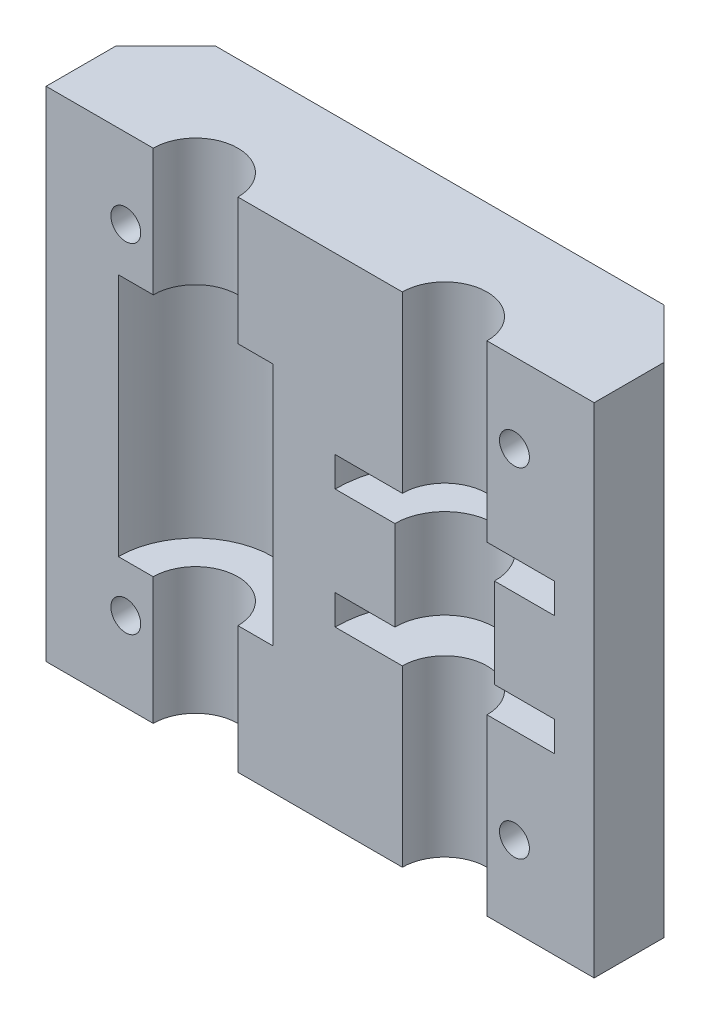
ISO-10303-21;
HEADER;
FILE_DESCRIPTION(('STEP AP214'),'2;1');
FILE_NAME('part.step','',(''),(''),'','','');
FILE_SCHEMA(('AUTOMOTIVE_DESIGN { 1 0 10303 214 1 1 1 1 }'));
ENDSEC;
DATA;
#1=APPLICATION_CONTEXT('core data for automotive mechanical design processes');
#2=APPLICATION_PROTOCOL_DEFINITION('international standard','automotive_design',2000,#1);
#3=PRODUCT_CONTEXT('',#1,'mechanical');
#4=PRODUCT('Part','Part','',(#3));
#5=PRODUCT_RELATED_PRODUCT_CATEGORY('part','',(#4));
#6=PRODUCT_DEFINITION_FORMATION('','',#4);
#7=PRODUCT_DEFINITION_CONTEXT('part definition',#1,'design');
#8=PRODUCT_DEFINITION('design','',#6,#7);
#9=PRODUCT_DEFINITION_SHAPE('','',#8);
#10=(LENGTH_UNIT() NAMED_UNIT(*) SI_UNIT(.MILLI.,.METRE.));
#11=(NAMED_UNIT(*) PLANE_ANGLE_UNIT() SI_UNIT($,.RADIAN.));
#12=(NAMED_UNIT(*) SI_UNIT($,.STERADIAN.) SOLID_ANGLE_UNIT());
#13=UNCERTAINTY_MEASURE_WITH_UNIT(LENGTH_MEASURE(1.E-05),#10,'distance_accuracy_value','');
#14=(GEOMETRIC_REPRESENTATION_CONTEXT(3) GLOBAL_UNCERTAINTY_ASSIGNED_CONTEXT((#13)) GLOBAL_UNIT_ASSIGNED_CONTEXT((#10,
#11,#12)) REPRESENTATION_CONTEXT('',''));
#15=CARTESIAN_POINT('',(0.,0.,0.));
#16=DIRECTION('',(0.,0.,1.));
#17=DIRECTION('',(1.,0.,0.));
#18=AXIS2_PLACEMENT_3D('',#15,#16,#17);
#19=CARTESIAN_POINT('',(0.,0.,12.));
#20=DIRECTION('',(0.,0.,-1.));
#21=DIRECTION('',(-1.,0.,0.));
#22=AXIS2_PLACEMENT_3D('',#19,#20,#21);
#23=PLANE('',#22);
#24=DIRECTION('',(-1.,0.,0.));
#25=VECTOR('',#24,1.);
#26=CARTESIAN_POINT('',(0.,-4.5,12.));
#27=LINE('',#26,#25);
#28=CARTESIAN_POINT('',(7.50000000000001,-4.5,12.));
#29=VERTEX_POINT('',#28);
#30=CARTESIAN_POINT('',(1.50000000000001,-4.5,12.));
#31=VERTEX_POINT('',#30);
#32=EDGE_CURVE('E214',#29,#31,#27,.T.);
#33=ORIENTED_EDGE('',*,*,#32,.F.);
#34=DIRECTION('',(0.,1.,0.));
#35=VECTOR('',#34,1.);
#36=CARTESIAN_POINT('',(7.50000000000001,-7.5,12.));
#37=LINE('',#36,#35);
#38=CARTESIAN_POINT('',(7.50000000000001,4.5,12.));
#39=VERTEX_POINT('',#38);
#40=EDGE_CURVE('E195',#29,#39,#37,.T.);
#41=ORIENTED_EDGE('',*,*,#40,.T.);
#42=DIRECTION('',(1.,0.,0.));
#43=VECTOR('',#42,1.);
#44=CARTESIAN_POINT('',(0.,4.5,12.));
#45=LINE('',#44,#43);
#46=CARTESIAN_POINT('',(1.50000000000001,4.5,12.));
#47=VERTEX_POINT('',#46);
#48=EDGE_CURVE('E276',#47,#39,#45,.T.);
#49=ORIENTED_EDGE('',*,*,#48,.F.);
#50=DIRECTION('',(0.,1.,0.));
#51=VECTOR('',#50,1.);
#52=CARTESIAN_POINT('',(1.50000000000001,4.5,12.));
#53=LINE('',#52,#51);
#54=CARTESIAN_POINT('',(1.50000000000001,7.5,12.));
#55=VERTEX_POINT('',#54);
#56=EDGE_CURVE('E279',#47,#55,#53,.T.);
#57=ORIENTED_EDGE('',*,*,#56,.T.);
#58=DIRECTION('',(1.,0.,0.));
#59=VECTOR('',#58,1.);
#60=CARTESIAN_POINT('',(0.,7.5,12.));
#61=LINE('',#60,#59);
#62=CARTESIAN_POINT('',(8.25000000000001,7.5,12.));
#63=VERTEX_POINT('',#62);
#64=EDGE_CURVE('E272',#55,#63,#61,.T.);
#65=ORIENTED_EDGE('',*,*,#64,.T.);
#66=DIRECTION('',(0.,1.,0.));
#67=VECTOR('',#66,1.);
#68=CARTESIAN_POINT('',(8.25000000000001,-25.,12.));
#69=LINE('',#68,#67);
#70=CARTESIAN_POINT('',(8.25000000000001,25.,12.));
#71=VERTEX_POINT('',#70);
#72=EDGE_CURVE('E348',#63,#71,#69,.T.);
#73=ORIENTED_EDGE('',*,*,#72,.T.);
#74=DIRECTION('',(-1.,0.,0.));
#75=VECTOR('',#74,1.);
#76=CARTESIAN_POINT('',(-27.5,25.,12.));
#77=LINE('',#76,#75);
#78=CARTESIAN_POINT('',(-8.24999999999999,25.,12.));
#79=VERTEX_POINT('',#78);
#80=EDGE_CURVE('E322',#71,#79,#77,.T.);
#81=ORIENTED_EDGE('',*,*,#80,.T.);
#82=DIRECTION('',(0.,1.,0.));
#83=VECTOR('',#82,1.);
#84=CARTESIAN_POINT('',(-8.24999999999999,-25.,12.));
#85=LINE('',#84,#83);
#86=CARTESIAN_POINT('',(-8.24999999999999,12.25,12.));
#87=VERTEX_POINT('',#86);
#88=EDGE_CURVE('E353',#79,#87,#85,.F.);
#89=ORIENTED_EDGE('',*,*,#88,.T.);
#90=DIRECTION('',(1.,0.,0.));
#91=VECTOR('',#90,1.);
#92=CARTESIAN_POINT('',(0.,12.25,12.));
#93=LINE('',#92,#91);
#94=CARTESIAN_POINT('',(-4.74999999999999,12.25,12.));
#95=VERTEX_POINT('',#94);
#96=EDGE_CURVE('E292',#87,#95,#93,.T.);
#97=ORIENTED_EDGE('',*,*,#96,.T.);
#98=DIRECTION('',(0.,-1.,0.));
#99=VECTOR('',#98,1.);
#100=CARTESIAN_POINT('',(-4.74999999999999,12.25,12.));
#101=LINE('',#100,#99);
#102=CARTESIAN_POINT('',(-4.74999999999999,-12.25,12.));
#103=VERTEX_POINT('',#102);
#104=EDGE_CURVE('E365',#103,#95,#101,.F.);
#105=ORIENTED_EDGE('',*,*,#104,.F.);
#106=DIRECTION('',(1.,0.,0.));
#107=VECTOR('',#106,1.);
#108=CARTESIAN_POINT('',(0.,-12.25,12.));
#109=LINE('',#108,#107);
#110=CARTESIAN_POINT('',(-8.24999999999999,-12.25,12.));
#111=VERTEX_POINT('',#110);
#112=EDGE_CURVE('E288',#111,#103,#109,.T.);
#113=ORIENTED_EDGE('',*,*,#112,.F.);
#114=CARTESIAN_POINT('',(-8.24999999999999,-25.,12.));
#115=VERTEX_POINT('',#114);
#116=EDGE_CURVE('E352',#111,#115,#85,.F.);
#117=ORIENTED_EDGE('',*,*,#116,.T.);
#118=DIRECTION('',(1.,0.,0.));
#119=VECTOR('',#118,1.);
#120=CARTESIAN_POINT('',(-27.5,-25.,12.));
#121=LINE('',#120,#119);
#122=CARTESIAN_POINT('',(8.25000000000001,-25.,12.));
#123=VERTEX_POINT('',#122);
#124=EDGE_CURVE('E329',#115,#123,#121,.T.);
#125=ORIENTED_EDGE('',*,*,#124,.T.);
#126=CARTESIAN_POINT('',(8.25000000000001,-7.5,12.));
#127=VERTEX_POINT('',#126);
#128=EDGE_CURVE('E349',#123,#127,#69,.T.);
#129=ORIENTED_EDGE('',*,*,#128,.T.);
#130=DIRECTION('',(1.,0.,0.));
#131=VECTOR('',#130,1.);
#132=CARTESIAN_POINT('',(0.,-7.5,12.));
#133=LINE('',#132,#131);
#134=CARTESIAN_POINT('',(1.50000000000001,-7.5,12.));
#135=VERTEX_POINT('',#134);
#136=EDGE_CURVE('E194',#135,#127,#133,.T.);
#137=ORIENTED_EDGE('',*,*,#136,.F.);
#138=DIRECTION('',(0.,-1.,0.));
#139=VECTOR('',#138,1.);
#140=CARTESIAN_POINT('',(1.50000000000001,-4.5,12.));
#141=LINE('',#140,#139);
#142=EDGE_CURVE('E203',#31,#135,#141,.T.);
#143=ORIENTED_EDGE('',*,*,#142,.F.);
#144=EDGE_LOOP('',(#33,#41,#49,#57,#65,#73,#81,#89,#97,#105,#113,#117,#125,#129,#137,#143));
#145=FACE_BOUND('',#144,.T.);
#146=ADVANCED_FACE('F34',(#145),#23,.F.);
#147=CARTESIAN_POINT('',(19.5,-17.,12.));
#148=DIRECTION('',(0.,0.,-1.));
#149=DIRECTION('',(1.,0.,0.));
#150=AXIS2_PLACEMENT_3D('',#147,#148,#149);
#151=CIRCLE('',#150,1.5);
#152=CARTESIAN_POINT('',(21.,-17.,12.));
#153=VERTEX_POINT('',#152);
#154=EDGE_CURVE('E245',#153,#153,#151,.T.);
#155=ORIENTED_EDGE('',*,*,#154,.T.);
#156=EDGE_LOOP('',(#155));
#157=FACE_BOUND('',#156,.T.);
#158=CARTESIAN_POINT('',(19.5,17.,12.));
#159=DIRECTION('',(0.,0.,-1.));
#160=DIRECTION('',(-1.,0.,0.));
#161=AXIS2_PLACEMENT_3D('',#158,#159,#160);
#162=CIRCLE('',#161,1.5);
#163=CARTESIAN_POINT('',(18.,17.,12.));
#164=VERTEX_POINT('',#163);
#165=EDGE_CURVE('E249',#164,#164,#162,.T.);
#166=ORIENTED_EDGE('',*,*,#165,.T.);
#167=EDGE_LOOP('',(#166));
#168=FACE_BOUND('',#167,.T.);
#169=DIRECTION('',(-1.,0.,0.));
#170=VECTOR('',#169,1.);
#171=CARTESIAN_POINT('',(0.,-4.5,12.));
#172=LINE('',#171,#170);
#173=CARTESIAN_POINT('',(23.5,-4.5,12.));
#174=VERTEX_POINT('',#173);
#175=CARTESIAN_POINT('',(17.5,-4.5,12.));
#176=VERTEX_POINT('',#175);
#177=EDGE_CURVE('E209',#174,#176,#172,.T.);
#178=ORIENTED_EDGE('',*,*,#177,.F.);
#179=DIRECTION('',(0.,-1.,0.));
#180=VECTOR('',#179,1.);
#181=CARTESIAN_POINT('',(23.5,-4.5,12.));
#182=LINE('',#181,#180);
#183=CARTESIAN_POINT('',(23.5,-7.5,12.));
#184=VERTEX_POINT('',#183);
#185=EDGE_CURVE('E11',#184,#174,#182,.F.);
#186=ORIENTED_EDGE('',*,*,#185,.F.);
#187=DIRECTION('',(1.,0.,0.));
#188=VECTOR('',#187,1.);
#189=CARTESIAN_POINT('',(0.,-7.5,12.));
#190=LINE('',#189,#188);
#191=CARTESIAN_POINT('',(16.75,-7.5,12.));
#192=VERTEX_POINT('',#191);
#193=EDGE_CURVE('E185',#192,#184,#190,.T.);
#194=ORIENTED_EDGE('',*,*,#193,.F.);
#195=DIRECTION('',(0.,1.,0.));
#196=VECTOR('',#195,1.);
#197=CARTESIAN_POINT('',(16.75,-25.,12.));
#198=LINE('',#197,#196);
#199=CARTESIAN_POINT('',(16.75,-25.,12.));
#200=VERTEX_POINT('',#199);
#201=EDGE_CURVE('E344',#192,#200,#198,.F.);
#202=ORIENTED_EDGE('',*,*,#201,.T.);
#203=CARTESIAN_POINT('',(27.5,-25.,12.));
#204=VERTEX_POINT('',#203);
#205=EDGE_CURVE('E324',#200,#204,#121,.T.);
#206=ORIENTED_EDGE('',*,*,#205,.T.);
#207=DIRECTION('',(0.,1.,0.));
#208=VECTOR('',#207,1.);
#209=CARTESIAN_POINT('',(27.5,-25.,12.));
#210=LINE('',#209,#208);
#211=CARTESIAN_POINT('',(27.5,25.,12.));
#212=VERTEX_POINT('',#211);
#213=EDGE_CURVE('E313',#204,#212,#210,.T.);
#214=ORIENTED_EDGE('',*,*,#213,.T.);
#215=CARTESIAN_POINT('',(16.75,25.,12.));
#216=VERTEX_POINT('',#215);
#217=EDGE_CURVE('E318',#212,#216,#77,.T.);
#218=ORIENTED_EDGE('',*,*,#217,.T.);
#219=CARTESIAN_POINT('',(16.75,7.5,12.));
#220=VERTEX_POINT('',#219);
#221=EDGE_CURVE('E345',#216,#220,#198,.F.);
#222=ORIENTED_EDGE('',*,*,#221,.T.);
#223=DIRECTION('',(1.,0.,0.));
#224=VECTOR('',#223,1.);
#225=CARTESIAN_POINT('',(0.,7.5,12.));
#226=LINE('',#225,#224);
#227=CARTESIAN_POINT('',(23.5,7.5,12.));
#228=VERTEX_POINT('',#227);
#229=EDGE_CURVE('E268',#220,#228,#226,.T.);
#230=ORIENTED_EDGE('',*,*,#229,.T.);
#231=DIRECTION('',(0.,1.,0.));
#232=VECTOR('',#231,1.);
#233=CARTESIAN_POINT('',(23.5,4.5,12.));
#234=LINE('',#233,#232);
#235=CARTESIAN_POINT('',(23.5,4.5,12.));
#236=VERTEX_POINT('',#235);
#237=EDGE_CURVE('E370',#228,#236,#234,.F.);
#238=ORIENTED_EDGE('',*,*,#237,.T.);
#239=DIRECTION('',(1.,0.,0.));
#240=VECTOR('',#239,1.);
#241=CARTESIAN_POINT('',(0.,4.5,12.));
#242=LINE('',#241,#240);
#243=CARTESIAN_POINT('',(17.5,4.5,12.));
#244=VERTEX_POINT('',#243);
#245=EDGE_CURVE('E274',#244,#236,#242,.T.);
#246=ORIENTED_EDGE('',*,*,#245,.F.);
#247=DIRECTION('',(0.,1.,0.));
#248=VECTOR('',#247,1.);
#249=CARTESIAN_POINT('',(17.5,-7.5,12.));
#250=LINE('',#249,#248);
#251=EDGE_CURVE('E211',#244,#176,#250,.F.);
#252=ORIENTED_EDGE('',*,*,#251,.T.);
#253=EDGE_LOOP('',(#178,#186,#194,#202,#206,#214,#218,#222,#230,#238,#246,#252));
#254=FACE_BOUND('',#253,.T.);
#255=ADVANCED_FACE('F207',(#157,#168,#254),#23,.F.);
#256=CARTESIAN_POINT('',(12.5,-7.5,12.));
#257=DIRECTION('',(0.,1.,0.));
#258=DIRECTION('',(0.,0.,1.));
#259=AXIS2_PLACEMENT_3D('',#256,#257,#258);
#260=CYLINDRICAL_SURFACE('',#259,5.);
#261=CARTESIAN_POINT('',(12.5,-4.5,12.));
#262=DIRECTION('',(0.,-1.,0.));
#263=DIRECTION('',(0.,0.,-1.));
#264=AXIS2_PLACEMENT_3D('',#261,#262,#263);
#265=CIRCLE('',#264,5.);
#266=EDGE_CURVE('E42',#176,#29,#265,.F.);
#267=ORIENTED_EDGE('',*,*,#266,.F.);
#268=ORIENTED_EDGE('',*,*,#251,.F.);
#269=CARTESIAN_POINT('',(12.5,4.5,12.));
#270=DIRECTION('',(0.,1.,0.));
#271=DIRECTION('',(0.,0.,1.));
#272=AXIS2_PLACEMENT_3D('',#269,#270,#271);
#273=CIRCLE('',#272,5.);
#274=EDGE_CURVE('E258',#244,#39,#273,.T.);
#275=ORIENTED_EDGE('',*,*,#274,.T.);
#276=ORIENTED_EDGE('',*,*,#40,.F.);
#277=EDGE_LOOP('',(#267,#268,#275,#276));
#278=FACE_BOUND('',#277,.T.);
#279=ADVANCED_FACE('F404',(#278),#260,.F.);
#280=CARTESIAN_POINT('',(-19.5,-17.,12.));
#281=DIRECTION('',(0.,0.,-1.));
#282=DIRECTION('',(-1.,0.,0.));
#283=AXIS2_PLACEMENT_3D('',#280,#281,#282);
#284=CYLINDRICAL_SURFACE('',#283,1.5);
#285=CARTESIAN_POINT('',(-19.5,-17.,12.));
#286=DIRECTION('',(0.,0.,-1.));
#287=DIRECTION('',(-1.,0.,0.));
#288=AXIS2_PLACEMENT_3D('',#285,#286,#287);
#289=CIRCLE('',#288,1.5);
#290=CARTESIAN_POINT('',(-21.,-17.,12.));
#291=VERTEX_POINT('',#290);
#292=EDGE_CURVE('E248',#291,#291,#289,.T.);
#293=ORIENTED_EDGE('',*,*,#292,.F.);
#294=EDGE_LOOP('',(#293));
#295=FACE_BOUND('',#294,.T.);
#296=CARTESIAN_POINT('',(-19.5,-17.,4.));
#297=DIRECTION('',(0.,0.,-1.));
#298=DIRECTION('',(-1.,0.,0.));
#299=AXIS2_PLACEMENT_3D('',#296,#297,#298);
#300=CIRCLE('',#299,1.5);
#301=CARTESIAN_POINT('',(-21.,-17.,4.));
#302=VERTEX_POINT('',#301);
#303=EDGE_CURVE('E255',#302,#302,#300,.F.);
#304=ORIENTED_EDGE('',*,*,#303,.F.);
#305=EDGE_LOOP('',(#304));
#306=FACE_BOUND('',#305,.T.);
#307=ADVANCED_FACE('F489',(#295,#306),#284,.F.);
#308=CARTESIAN_POINT('',(19.5,17.,12.));
#309=DIRECTION('',(0.,0.,-1.));
#310=DIRECTION('',(-1.,0.,0.));
#311=AXIS2_PLACEMENT_3D('',#308,#309,#310);
#312=CYLINDRICAL_SURFACE('',#311,1.5);
#313=ORIENTED_EDGE('',*,*,#165,.F.);
#314=EDGE_LOOP('',(#313));
#315=FACE_BOUND('',#314,.T.);
#316=CARTESIAN_POINT('',(19.5,17.,4.));
#317=DIRECTION('',(0.,0.,-1.));
#318=DIRECTION('',(-1.,0.,0.));
#319=AXIS2_PLACEMENT_3D('',#316,#317,#318);
#320=CIRCLE('',#319,1.5);
#321=CARTESIAN_POINT('',(18.,17.,4.));
#322=VERTEX_POINT('',#321);
#323=EDGE_CURVE('E377',#322,#322,#320,.F.);
#324=ORIENTED_EDGE('',*,*,#323,.F.);
#325=EDGE_LOOP('',(#324));
#326=FACE_BOUND('',#325,.T.);
#327=ADVANCED_FACE('F492',(#315,#326),#312,.F.);
#328=CARTESIAN_POINT('',(12.5,-25.,12.));
#329=DIRECTION('',(0.,1.,0.));
#330=DIRECTION('',(0.,0.,1.));
#331=AXIS2_PLACEMENT_3D('',#328,#329,#330);
#332=CYLINDRICAL_SURFACE('',#331,4.25000000000001);
#333=CARTESIAN_POINT('',(12.5,-7.5,12.));
#334=DIRECTION('',(0.,1.,0.));
#335=DIRECTION('',(0.,0.,1.));
#336=AXIS2_PLACEMENT_3D('',#333,#334,#335);
#337=CIRCLE('',#336,4.25000000000001);
#338=EDGE_CURVE('E190',#127,#192,#337,.F.);
#339=ORIENTED_EDGE('',*,*,#338,.F.);
#340=ORIENTED_EDGE('',*,*,#128,.F.);
#341=CARTESIAN_POINT('',(12.5,-25.,12.));
#342=DIRECTION('',(0.,1.,0.));
#343=DIRECTION('',(0.,0.,1.));
#344=AXIS2_PLACEMENT_3D('',#341,#342,#343);
#345=CIRCLE('',#344,4.25000000000001);
#346=EDGE_CURVE('E308',#200,#123,#345,.T.);
#347=ORIENTED_EDGE('',*,*,#346,.F.);
#348=ORIENTED_EDGE('',*,*,#201,.F.);
#349=EDGE_LOOP('',(#339,#340,#347,#348));
#350=FACE_BOUND('',#349,.T.);
#351=ADVANCED_FACE('F468',(#350),#332,.F.);
#352=CARTESIAN_POINT('',(-12.5,-25.,12.));
#353=DIRECTION('',(0.,1.,0.));
#354=DIRECTION('',(0.,0.,1.));
#355=AXIS2_PLACEMENT_3D('',#352,#353,#354);
#356=CYLINDRICAL_SURFACE('',#355,4.25);
#357=CARTESIAN_POINT('',(-12.5,-12.25,12.));
#358=DIRECTION('',(0.,1.,0.));
#359=DIRECTION('',(0.,0.,1.));
#360=AXIS2_PLACEMENT_3D('',#357,#358,#359);
#361=CIRCLE('',#360,4.25);
#362=CARTESIAN_POINT('',(-16.75,-12.25,12.));
#363=VERTEX_POINT('',#362);
#364=EDGE_CURVE('E360',#363,#111,#361,.F.);
#365=ORIENTED_EDGE('',*,*,#364,.F.);
#366=DIRECTION('',(0.,1.,0.));
#367=VECTOR('',#366,1.);
#368=CARTESIAN_POINT('',(-16.75,-25.,12.));
#369=LINE('',#368,#367);
#370=CARTESIAN_POINT('',(-16.75,-25.,12.));
#371=VERTEX_POINT('',#370);
#372=EDGE_CURVE('E357',#371,#363,#369,.T.);
#373=ORIENTED_EDGE('',*,*,#372,.F.);
#374=CARTESIAN_POINT('',(-12.5,-25.,12.));
#375=DIRECTION('',(0.,1.,0.));
#376=DIRECTION('',(0.,0.,1.));
#377=AXIS2_PLACEMENT_3D('',#374,#375,#376);
#378=CIRCLE('',#377,4.25);
#379=EDGE_CURVE('E301',#115,#371,#378,.T.);
#380=ORIENTED_EDGE('',*,*,#379,.F.);
#381=ORIENTED_EDGE('',*,*,#116,.F.);
#382=EDGE_LOOP('',(#365,#373,#380,#381));
#383=FACE_BOUND('',#382,.T.);
#384=ADVANCED_FACE('F444',(#383),#356,.F.);
#385=CARTESIAN_POINT('',(-19.5,17.,12.));
#386=DIRECTION('',(0.,0.,-1.));
#387=DIRECTION('',(1.,0.,0.));
#388=AXIS2_PLACEMENT_3D('',#385,#386,#387);
#389=CIRCLE('',#388,1.5);
#390=CARTESIAN_POINT('',(-18.,17.,12.));
#391=VERTEX_POINT('',#390);
#392=EDGE_CURVE('E252',#391,#391,#389,.T.);
#393=ORIENTED_EDGE('',*,*,#392,.T.);
#394=EDGE_LOOP('',(#393));
#395=FACE_BOUND('',#394,.T.);
#396=ORIENTED_EDGE('',*,*,#292,.T.);
#397=EDGE_LOOP('',(#396));
#398=FACE_BOUND('',#397,.T.);
#399=DIRECTION('',(0.,-1.,0.));
#400=VECTOR('',#399,1.);
#401=CARTESIAN_POINT('',(-20.25,12.25,12.));
#402=LINE('',#401,#400);
#403=CARTESIAN_POINT('',(-20.25,12.25,12.));
#404=VERTEX_POINT('',#403);
#405=CARTESIAN_POINT('',(-20.25,-12.25,12.));
#406=VERTEX_POINT('',#405);
#407=EDGE_CURVE('E298',#404,#406,#402,.T.);
#408=ORIENTED_EDGE('',*,*,#407,.F.);
#409=DIRECTION('',(1.,0.,0.));
#410=VECTOR('',#409,1.);
#411=CARTESIAN_POINT('',(0.,12.25,12.));
#412=LINE('',#411,#410);
#413=CARTESIAN_POINT('',(-16.75,12.25,12.));
#414=VERTEX_POINT('',#413);
#415=EDGE_CURVE('E295',#404,#414,#412,.T.);
#416=ORIENTED_EDGE('',*,*,#415,.T.);
#417=CARTESIAN_POINT('',(-16.75,25.,12.));
#418=VERTEX_POINT('',#417);
#419=EDGE_CURVE('E356',#414,#418,#369,.T.);
#420=ORIENTED_EDGE('',*,*,#419,.T.);
#421=CARTESIAN_POINT('',(-27.5,25.,12.));
#422=VERTEX_POINT('',#421);
#423=EDGE_CURVE('E316',#418,#422,#77,.T.);
#424=ORIENTED_EDGE('',*,*,#423,.T.);
#425=DIRECTION('',(0.,-1.,0.));
#426=VECTOR('',#425,1.);
#427=CARTESIAN_POINT('',(-27.5,-25.,12.));
#428=LINE('',#427,#426);
#429=CARTESIAN_POINT('',(-27.5,-25.,12.));
#430=VERTEX_POINT('',#429);
#431=EDGE_CURVE('E321',#422,#430,#428,.T.);
#432=ORIENTED_EDGE('',*,*,#431,.T.);
#433=EDGE_CURVE('E325',#430,#371,#121,.T.);
#434=ORIENTED_EDGE('',*,*,#433,.T.);
#435=ORIENTED_EDGE('',*,*,#372,.T.);
#436=DIRECTION('',(1.,0.,0.));
#437=VECTOR('',#436,1.);
#438=CARTESIAN_POINT('',(0.,-12.25,12.));
#439=LINE('',#438,#437);
#440=EDGE_CURVE('E290',#406,#363,#439,.T.);
#441=ORIENTED_EDGE('',*,*,#440,.F.);
#442=EDGE_LOOP('',(#408,#416,#420,#424,#432,#434,#435,#441));
#443=FACE_BOUND('',#442,.T.);
#444=ADVANCED_FACE('F428',(#395,#398,#443),#23,.F.);
#445=CARTESIAN_POINT('',(27.5,-25.,12.));
#446=DIRECTION('',(-1.,0.,0.));
#447=DIRECTION('',(0.,0.,1.));
#448=AXIS2_PLACEMENT_3D('',#445,#446,#447);
#449=PLANE('',#448);
#450=DIRECTION('',(0.,0.,-1.));
#451=VECTOR('',#450,1.);
#452=CARTESIAN_POINT('',(27.5,-25.,12.));
#453=LINE('',#452,#451);
#454=CARTESIAN_POINT('',(27.5,-25.,5.));
#455=VERTEX_POINT('',#454);
#456=EDGE_CURVE('E328',#204,#455,#453,.T.);
#457=ORIENTED_EDGE('',*,*,#456,.T.);
#458=DIRECTION('',(0.,1.,0.));
#459=VECTOR('',#458,1.);
#460=CARTESIAN_POINT('',(27.5,25.,5.));
#461=LINE('',#460,#459);
#462=CARTESIAN_POINT('',(27.5,25.,5.));
#463=VERTEX_POINT('',#462);
#464=EDGE_CURVE('E374',#455,#463,#461,.T.);
#465=ORIENTED_EDGE('',*,*,#464,.T.);
#466=DIRECTION('',(0.,0.,-1.));
#467=VECTOR('',#466,1.);
#468=CARTESIAN_POINT('',(27.5,25.,12.));
#469=LINE('',#468,#467);
#470=EDGE_CURVE('E341',#212,#463,#469,.T.);
#471=ORIENTED_EDGE('',*,*,#470,.F.);
#472=ORIENTED_EDGE('',*,*,#213,.F.);
#473=EDGE_LOOP('',(#457,#465,#471,#472));
#474=FACE_BOUND('',#473,.T.);
#475=ADVANCED_FACE('F478',(#474),#449,.F.);
#476=CARTESIAN_POINT('',(-27.5,25.,12.));
#477=DIRECTION('',(0.,-1.,0.));
#478=DIRECTION('',(0.,0.,-1.));
#479=AXIS2_PLACEMENT_3D('',#476,#477,#478);
#480=PLANE('',#479);
#481=ORIENTED_EDGE('',*,*,#470,.T.);
#482=DIRECTION('',(-0.707106781186549,0.,-0.707106781186546));
#483=VECTOR('',#482,1.);
#484=CARTESIAN_POINT('',(27.5,25.,5.));
#485=LINE('',#484,#483);
#486=CARTESIAN_POINT('',(22.5,25.,0.));
#487=VERTEX_POINT('',#486);
#488=EDGE_CURVE('E389',#463,#487,#485,.T.);
#489=ORIENTED_EDGE('',*,*,#488,.T.);
#490=DIRECTION('',(-1.,0.,0.));
#491=VECTOR('',#490,1.);
#492=CARTESIAN_POINT('',(-27.5,25.,0.));
#493=LINE('',#492,#491);
#494=CARTESIAN_POINT('',(-22.5,25.,0.));
#495=VERTEX_POINT('',#494);
#496=EDGE_CURVE('E304',#487,#495,#493,.T.);
#497=ORIENTED_EDGE('',*,*,#496,.T.);
#498=DIRECTION('',(-0.707106781186549,0.,0.707106781186546));
#499=VECTOR('',#498,1.);
#500=CARTESIAN_POINT('',(-27.5,25.,5.));
#501=LINE('',#500,#499);
#502=CARTESIAN_POINT('',(-27.5,25.,5.));
#503=VERTEX_POINT('',#502);
#504=EDGE_CURVE('E387',#495,#503,#501,.T.);
#505=ORIENTED_EDGE('',*,*,#504,.T.);
#506=DIRECTION('',(0.,0.,-1.));
#507=VECTOR('',#506,1.);
#508=CARTESIAN_POINT('',(-27.5,25.,12.));
#509=LINE('',#508,#507);
#510=EDGE_CURVE('E338',#422,#503,#509,.T.);
#511=ORIENTED_EDGE('',*,*,#510,.F.);
#512=ORIENTED_EDGE('',*,*,#423,.F.);
#513=CARTESIAN_POINT('',(-12.5,25.,12.));
#514=DIRECTION('',(0.,1.,0.));
#515=DIRECTION('',(0.,0.,1.));
#516=AXIS2_PLACEMENT_3D('',#513,#514,#515);
#517=CIRCLE('',#516,4.25);
#518=EDGE_CURVE('E305',#79,#418,#517,.T.);
#519=ORIENTED_EDGE('',*,*,#518,.F.);
#520=ORIENTED_EDGE('',*,*,#80,.F.);
#521=CARTESIAN_POINT('',(12.5,25.,12.));
#522=DIRECTION('',(0.,1.,0.));
#523=DIRECTION('',(0.,0.,1.));
#524=AXIS2_PLACEMENT_3D('',#521,#522,#523);
#525=CIRCLE('',#524,4.25000000000001);
#526=EDGE_CURVE('E300',#216,#71,#525,.T.);
#527=ORIENTED_EDGE('',*,*,#526,.F.);
#528=ORIENTED_EDGE('',*,*,#217,.F.);
#529=EDGE_LOOP('',(#481,#489,#497,#505,#511,#512,#519,#520,#527,#528));
#530=FACE_BOUND('',#529,.T.);
#531=ADVANCED_FACE('F432',(#530),#480,.F.);
#532=CARTESIAN_POINT('',(-27.5,-25.,12.));
#533=DIRECTION('',(1.,0.,0.));
#534=DIRECTION('',(0.,0.,-1.));
#535=AXIS2_PLACEMENT_3D('',#532,#533,#534);
#536=PLANE('',#535);
#537=ORIENTED_EDGE('',*,*,#510,.T.);
#538=DIRECTION('',(0.,-1.,0.));
#539=VECTOR('',#538,1.);
#540=CARTESIAN_POINT('',(-27.5,-25.,5.));
#541=LINE('',#540,#539);
#542=CARTESIAN_POINT('',(-27.5,-25.,5.));
#543=VERTEX_POINT('',#542);
#544=EDGE_CURVE('E397',#503,#543,#541,.T.);
#545=ORIENTED_EDGE('',*,*,#544,.T.);
#546=DIRECTION('',(0.,0.,-1.));
#547=VECTOR('',#546,1.);
#548=CARTESIAN_POINT('',(-27.5,-25.,12.));
#549=LINE('',#548,#547);
#550=EDGE_CURVE('E335',#430,#543,#549,.T.);
#551=ORIENTED_EDGE('',*,*,#550,.F.);
#552=ORIENTED_EDGE('',*,*,#431,.F.);
#553=EDGE_LOOP('',(#537,#545,#551,#552));
#554=FACE_BOUND('',#553,.T.);
#555=ADVANCED_FACE('F435',(#554),#536,.F.);
#556=CARTESIAN_POINT('',(-27.5,-25.,12.));
#557=DIRECTION('',(0.,1.,0.));
#558=DIRECTION('',(0.,0.,1.));
#559=AXIS2_PLACEMENT_3D('',#556,#557,#558);
#560=PLANE('',#559);
#561=DIRECTION('',(1.,0.,0.));
#562=VECTOR('',#561,1.);
#563=CARTESIAN_POINT('',(-27.5,-25.,0.));
#564=LINE('',#563,#562);
#565=CARTESIAN_POINT('',(-22.5,-25.,0.));
#566=VERTEX_POINT('',#565);
#567=CARTESIAN_POINT('',(22.5,-25.,0.));
#568=VERTEX_POINT('',#567);
#569=EDGE_CURVE('E317',#566,#568,#564,.T.);
#570=ORIENTED_EDGE('',*,*,#569,.T.);
#571=DIRECTION('',(0.707106781186549,0.,0.707106781186546));
#572=VECTOR('',#571,1.);
#573=CARTESIAN_POINT('',(27.5,-25.,5.));
#574=LINE('',#573,#572);
#575=EDGE_CURVE('E395',#568,#455,#574,.T.);
#576=ORIENTED_EDGE('',*,*,#575,.T.);
#577=ORIENTED_EDGE('',*,*,#456,.F.);
#578=ORIENTED_EDGE('',*,*,#205,.F.);
#579=ORIENTED_EDGE('',*,*,#346,.T.);
#580=ORIENTED_EDGE('',*,*,#124,.F.);
#581=ORIENTED_EDGE('',*,*,#379,.T.);
#582=ORIENTED_EDGE('',*,*,#433,.F.);
#583=ORIENTED_EDGE('',*,*,#550,.T.);
#584=DIRECTION('',(0.707106781186549,0.,-0.707106781186546));
#585=VECTOR('',#584,1.);
#586=CARTESIAN_POINT('',(-27.5,-25.,5.));
#587=LINE('',#586,#585);
#588=EDGE_CURVE('E49',#543,#566,#587,.T.);
#589=ORIENTED_EDGE('',*,*,#588,.T.);
#590=EDGE_LOOP('',(#570,#576,#577,#578,#579,#580,#581,#582,#583,#589));
#591=FACE_BOUND('',#590,.T.);
#592=ADVANCED_FACE('F438',(#591),#560,.F.);
#593=CARTESIAN_POINT('',(0.,0.,0.));
#594=DIRECTION('',(0.,0.,-1.));
#595=DIRECTION('',(-1.,0.,0.));
#596=AXIS2_PLACEMENT_3D('',#593,#594,#595);
#597=PLANE('',#596);
#598=CARTESIAN_POINT('',(19.5,-17.,0.));
#599=DIRECTION('',(0.,0.,-1.));
#600=DIRECTION('',(1.,0.,0.));
#601=AXIS2_PLACEMENT_3D('',#598,#599,#600);
#602=CIRCLE('',#601,2.5);
#603=CARTESIAN_POINT('',(22.,-17.,0.));
#604=VERTEX_POINT('',#603);
#605=EDGE_CURVE('E220',#604,#604,#602,.T.);
#606=ORIENTED_EDGE('',*,*,#605,.F.);
#607=EDGE_LOOP('',(#606));
#608=FACE_BOUND('',#607,.T.);
#609=CARTESIAN_POINT('',(19.5,17.,0.));
#610=DIRECTION('',(0.,0.,-1.));
#611=DIRECTION('',(-1.,0.,0.));
#612=AXIS2_PLACEMENT_3D('',#609,#610,#611);
#613=CIRCLE('',#612,2.5);
#614=CARTESIAN_POINT('',(17.,17.,0.));
#615=VERTEX_POINT('',#614);
#616=EDGE_CURVE('E231',#615,#615,#613,.T.);
#617=ORIENTED_EDGE('',*,*,#616,.F.);
#618=EDGE_LOOP('',(#617));
#619=FACE_BOUND('',#618,.T.);
#620=CARTESIAN_POINT('',(-19.5,17.,0.));
#621=DIRECTION('',(0.,0.,-1.));
#622=DIRECTION('',(1.,0.,0.));
#623=AXIS2_PLACEMENT_3D('',#620,#621,#622);
#624=CIRCLE('',#623,2.5);
#625=CARTESIAN_POINT('',(-17.,17.,0.));
#626=VERTEX_POINT('',#625);
#627=EDGE_CURVE('E225',#626,#626,#624,.T.);
#628=ORIENTED_EDGE('',*,*,#627,.F.);
#629=EDGE_LOOP('',(#628));
#630=FACE_BOUND('',#629,.T.);
#631=CARTESIAN_POINT('',(-19.5,-17.,0.));
#632=DIRECTION('',(0.,0.,-1.));
#633=DIRECTION('',(-1.,0.,0.));
#634=AXIS2_PLACEMENT_3D('',#631,#632,#633);
#635=CIRCLE('',#634,2.5);
#636=CARTESIAN_POINT('',(-22.,-17.,0.));
#637=VERTEX_POINT('',#636);
#638=EDGE_CURVE('E224',#637,#637,#635,.T.);
#639=ORIENTED_EDGE('',*,*,#638,.F.);
#640=EDGE_LOOP('',(#639));
#641=FACE_BOUND('',#640,.T.);
#642=ORIENTED_EDGE('',*,*,#496,.F.);
#643=DIRECTION('',(0.,-1.,0.));
#644=VECTOR('',#643,1.);
#645=CARTESIAN_POINT('',(22.5,-25.,0.));
#646=LINE('',#645,#644);
#647=EDGE_CURVE('E57',#487,#568,#646,.T.);
#648=ORIENTED_EDGE('',*,*,#647,.T.);
#649=ORIENTED_EDGE('',*,*,#569,.F.);
#650=DIRECTION('',(0.,1.,0.));
#651=VECTOR('',#650,1.);
#652=CARTESIAN_POINT('',(-22.5,25.,0.));
#653=LINE('',#652,#651);
#654=EDGE_CURVE('E391',#566,#495,#653,.T.);
#655=ORIENTED_EDGE('',*,*,#654,.T.);
#656=EDGE_LOOP('',(#642,#648,#649,#655));
#657=FACE_BOUND('',#656,.T.);
#658=ADVANCED_FACE('F466',(#608,#619,#630,#641,#657),#597,.T.);
#659=ORIENTED_EDGE('',*,*,#72,.F.);
#660=CARTESIAN_POINT('',(12.5,7.5,12.));
#661=DIRECTION('',(0.,1.,0.));
#662=DIRECTION('',(0.,0.,1.));
#663=AXIS2_PLACEMENT_3D('',#660,#661,#662);
#664=CIRCLE('',#663,4.25000000000001);
#665=EDGE_CURVE('E367',#63,#220,#664,.F.);
#666=ORIENTED_EDGE('',*,*,#665,.T.);
#667=ORIENTED_EDGE('',*,*,#221,.F.);
#668=ORIENTED_EDGE('',*,*,#526,.T.);
#669=EDGE_LOOP('',(#659,#666,#667,#668));
#670=FACE_BOUND('',#669,.T.);
#671=ADVANCED_FACE('F418',(#670),#332,.F.);
#672=ORIENTED_EDGE('',*,*,#419,.F.);
#673=CARTESIAN_POINT('',(-12.5,12.25,12.));
#674=DIRECTION('',(0.,1.,0.));
#675=DIRECTION('',(0.,0.,1.));
#676=AXIS2_PLACEMENT_3D('',#673,#674,#675);
#677=CIRCLE('',#676,4.25);
#678=EDGE_CURVE('E362',#414,#87,#677,.F.);
#679=ORIENTED_EDGE('',*,*,#678,.T.);
#680=ORIENTED_EDGE('',*,*,#88,.F.);
#681=ORIENTED_EDGE('',*,*,#518,.T.);
#682=EDGE_LOOP('',(#672,#679,#680,#681));
#683=FACE_BOUND('',#682,.T.);
#684=ADVANCED_FACE('F458',(#683),#356,.F.);
#685=CARTESIAN_POINT('',(-12.5,12.25,12.));
#686=DIRECTION('',(0.,-1.,0.));
#687=DIRECTION('',(0.,0.,-1.));
#688=AXIS2_PLACEMENT_3D('',#685,#686,#687);
#689=CYLINDRICAL_SURFACE('',#688,7.75);
#690=ORIENTED_EDGE('',*,*,#407,.T.);
#691=CARTESIAN_POINT('',(-12.5,-12.25,12.));
#692=DIRECTION('',(0.,1.,0.));
#693=DIRECTION('',(0.,0.,1.));
#694=AXIS2_PLACEMENT_3D('',#691,#692,#693);
#695=CIRCLE('',#694,7.75);
#696=EDGE_CURVE('E282',#103,#406,#695,.T.);
#697=ORIENTED_EDGE('',*,*,#696,.F.);
#698=ORIENTED_EDGE('',*,*,#104,.T.);
#699=CARTESIAN_POINT('',(-12.5,12.25,12.));
#700=DIRECTION('',(0.,1.,0.));
#701=DIRECTION('',(0.,0.,1.));
#702=AXIS2_PLACEMENT_3D('',#699,#700,#701);
#703=CIRCLE('',#702,7.75);
#704=EDGE_CURVE('E285',#95,#404,#703,.T.);
#705=ORIENTED_EDGE('',*,*,#704,.T.);
#706=EDGE_LOOP('',(#690,#697,#698,#705));
#707=FACE_BOUND('',#706,.T.);
#708=ADVANCED_FACE('F454',(#707),#689,.F.);
#709=CARTESIAN_POINT('',(-12.5,12.25,12.));
#710=DIRECTION('',(0.,1.,0.));
#711=DIRECTION('',(0.,0.,1.));
#712=AXIS2_PLACEMENT_3D('',#709,#710,#711);
#713=PLANE('',#712);
#714=ORIENTED_EDGE('',*,*,#704,.F.);
#715=ORIENTED_EDGE('',*,*,#96,.F.);
#716=ORIENTED_EDGE('',*,*,#678,.F.);
#717=ORIENTED_EDGE('',*,*,#415,.F.);
#718=EDGE_LOOP('',(#714,#715,#716,#717));
#719=FACE_BOUND('',#718,.T.);
#720=ADVANCED_FACE('F456',(#719),#713,.F.);
#721=CARTESIAN_POINT('',(-12.5,-12.25,12.));
#722=DIRECTION('',(0.,1.,0.));
#723=DIRECTION('',(0.,0.,1.));
#724=AXIS2_PLACEMENT_3D('',#721,#722,#723);
#725=PLANE('',#724);
#726=ORIENTED_EDGE('',*,*,#440,.T.);
#727=ORIENTED_EDGE('',*,*,#364,.T.);
#728=ORIENTED_EDGE('',*,*,#112,.T.);
#729=ORIENTED_EDGE('',*,*,#696,.T.);
#730=EDGE_LOOP('',(#726,#727,#728,#729));
#731=FACE_BOUND('',#730,.T.);
#732=ADVANCED_FACE('F448',(#731),#725,.T.);
#733=CARTESIAN_POINT('',(12.5,4.5,12.));
#734=DIRECTION('',(0.,1.,0.));
#735=DIRECTION('',(0.,0.,1.));
#736=AXIS2_PLACEMENT_3D('',#733,#734,#735);
#737=CYLINDRICAL_SURFACE('',#736,11.);
#738=CARTESIAN_POINT('',(12.5,4.5,12.));
#739=DIRECTION('',(0.,1.,0.));
#740=DIRECTION('',(0.,0.,1.));
#741=AXIS2_PLACEMENT_3D('',#738,#739,#740);
#742=CIRCLE('',#741,11.);
#743=EDGE_CURVE('E265',#236,#47,#742,.T.);
#744=ORIENTED_EDGE('',*,*,#743,.F.);
#745=ORIENTED_EDGE('',*,*,#237,.F.);
#746=CARTESIAN_POINT('',(12.5,7.5,12.));
#747=DIRECTION('',(0.,1.,0.));
#748=DIRECTION('',(0.,0.,1.));
#749=AXIS2_PLACEMENT_3D('',#746,#747,#748);
#750=CIRCLE('',#749,11.);
#751=EDGE_CURVE('E264',#228,#55,#750,.T.);
#752=ORIENTED_EDGE('',*,*,#751,.T.);
#753=ORIENTED_EDGE('',*,*,#56,.F.);
#754=EDGE_LOOP('',(#744,#745,#752,#753));
#755=FACE_BOUND('',#754,.T.);
#756=ADVANCED_FACE('F411',(#755),#737,.F.);
#757=CARTESIAN_POINT('',(12.5,4.5,12.));
#758=DIRECTION('',(0.,1.,0.));
#759=DIRECTION('',(0.,0.,1.));
#760=AXIS2_PLACEMENT_3D('',#757,#758,#759);
#761=PLANE('',#760);
#762=ORIENTED_EDGE('',*,*,#274,.F.);
#763=ORIENTED_EDGE('',*,*,#245,.T.);
#764=ORIENTED_EDGE('',*,*,#743,.T.);
#765=ORIENTED_EDGE('',*,*,#48,.T.);
#766=EDGE_LOOP('',(#762,#763,#764,#765));
#767=FACE_BOUND('',#766,.T.);
#768=ADVANCED_FACE('F407',(#767),#761,.T.);
#769=CARTESIAN_POINT('',(12.5,7.5,12.));
#770=DIRECTION('',(0.,1.,0.));
#771=DIRECTION('',(0.,0.,1.));
#772=AXIS2_PLACEMENT_3D('',#769,#770,#771);
#773=PLANE('',#772);
#774=ORIENTED_EDGE('',*,*,#751,.F.);
#775=ORIENTED_EDGE('',*,*,#229,.F.);
#776=ORIENTED_EDGE('',*,*,#665,.F.);
#777=ORIENTED_EDGE('',*,*,#64,.F.);
#778=EDGE_LOOP('',(#774,#775,#776,#777));
#779=FACE_BOUND('',#778,.T.);
#780=ADVANCED_FACE('F415',(#779),#773,.F.);
#781=CARTESIAN_POINT('',(12.5,-7.5,12.));
#782=DIRECTION('',(0.,1.,0.));
#783=DIRECTION('',(0.,0.,1.));
#784=AXIS2_PLACEMENT_3D('',#781,#782,#783);
#785=PLANE('',#784);
#786=ORIENTED_EDGE('',*,*,#136,.T.);
#787=ORIENTED_EDGE('',*,*,#338,.T.);
#788=ORIENTED_EDGE('',*,*,#193,.T.);
#789=CARTESIAN_POINT('',(12.5,-7.5,12.));
#790=DIRECTION('',(0.,1.,0.));
#791=DIRECTION('',(0.,0.,1.));
#792=AXIS2_PLACEMENT_3D('',#789,#790,#791);
#793=CIRCLE('',#792,11.);
#794=EDGE_CURVE('E188',#184,#135,#793,.T.);
#795=ORIENTED_EDGE('',*,*,#794,.T.);
#796=EDGE_LOOP('',(#786,#787,#788,#795));
#797=FACE_BOUND('',#796,.T.);
#798=ADVANCED_FACE('F187',(#797),#785,.T.);
#799=CARTESIAN_POINT('',(19.5,-17.,12.));
#800=DIRECTION('',(0.,0.,-1.));
#801=DIRECTION('',(-1.,0.,0.));
#802=AXIS2_PLACEMENT_3D('',#799,#800,#801);
#803=CYLINDRICAL_SURFACE('',#802,1.5);
#804=CARTESIAN_POINT('',(19.5,-17.,4.));
#805=DIRECTION('',(0.,0.,1.));
#806=DIRECTION('',(1.,0.,0.));
#807=AXIS2_PLACEMENT_3D('',#804,#805,#806);
#808=CIRCLE('',#807,1.5);
#809=CARTESIAN_POINT('',(21.,-17.,4.));
#810=VERTEX_POINT('',#809);
#811=EDGE_CURVE('E380',#810,#810,#808,.F.);
#812=ORIENTED_EDGE('',*,*,#811,.T.);
#813=EDGE_LOOP('',(#812));
#814=FACE_BOUND('',#813,.T.);
#815=ORIENTED_EDGE('',*,*,#154,.F.);
#816=EDGE_LOOP('',(#815));
#817=FACE_BOUND('',#816,.T.);
#818=ADVANCED_FACE('F514',(#814,#817),#803,.F.);
#819=CARTESIAN_POINT('',(-19.5,17.,12.));
#820=DIRECTION('',(0.,0.,-1.));
#821=DIRECTION('',(-1.,0.,0.));
#822=AXIS2_PLACEMENT_3D('',#819,#820,#821);
#823=CYLINDRICAL_SURFACE('',#822,1.5);
#824=CARTESIAN_POINT('',(-19.5,17.,4.));
#825=DIRECTION('',(0.,0.,1.));
#826=DIRECTION('',(1.,0.,0.));
#827=AXIS2_PLACEMENT_3D('',#824,#825,#826);
#828=CIRCLE('',#827,1.5);
#829=CARTESIAN_POINT('',(-18.,17.,4.));
#830=VERTEX_POINT('',#829);
#831=EDGE_CURVE('E242',#830,#830,#828,.F.);
#832=ORIENTED_EDGE('',*,*,#831,.T.);
#833=EDGE_LOOP('',(#832));
#834=FACE_BOUND('',#833,.T.);
#835=ORIENTED_EDGE('',*,*,#392,.F.);
#836=EDGE_LOOP('',(#835));
#837=FACE_BOUND('',#836,.T.);
#838=ADVANCED_FACE('F517',(#834,#837),#823,.F.);
#839=CARTESIAN_POINT('',(-19.5,17.,4.));
#840=DIRECTION('',(0.,0.,1.));
#841=DIRECTION('',(1.,0.,0.));
#842=AXIS2_PLACEMENT_3D('',#839,#840,#841);
#843=PLANE('',#842);
#844=CARTESIAN_POINT('',(-19.5,17.,4.));
#845=DIRECTION('',(0.,0.,-1.));
#846=DIRECTION('',(1.,0.,0.));
#847=AXIS2_PLACEMENT_3D('',#844,#845,#846);
#848=CIRCLE('',#847,2.5);
#849=CARTESIAN_POINT('',(-17.,17.,4.));
#850=VERTEX_POINT('',#849);
#851=EDGE_CURVE('E221',#850,#850,#848,.T.);
#852=ORIENTED_EDGE('',*,*,#851,.T.);
#853=EDGE_LOOP('',(#852));
#854=FACE_BOUND('',#853,.T.);
#855=ORIENTED_EDGE('',*,*,#831,.F.);
#856=EDGE_LOOP('',(#855));
#857=FACE_BOUND('',#856,.T.);
#858=ADVANCED_FACE('F523',(#854,#857),#843,.F.);
#859=CARTESIAN_POINT('',(-19.5,17.,4.));
#860=DIRECTION('',(0.,0.,-1.));
#861=DIRECTION('',(-1.,0.,0.));
#862=AXIS2_PLACEMENT_3D('',#859,#860,#861);
#863=CYLINDRICAL_SURFACE('',#862,2.5);
#864=ORIENTED_EDGE('',*,*,#851,.F.);
#865=EDGE_LOOP('',(#864));
#866=FACE_BOUND('',#865,.T.);
#867=ORIENTED_EDGE('',*,*,#627,.T.);
#868=EDGE_LOOP('',(#867));
#869=FACE_BOUND('',#868,.T.);
#870=ADVANCED_FACE('F582',(#866,#869),#863,.F.);
#871=CARTESIAN_POINT('',(19.5,17.,4.));
#872=DIRECTION('',(0.,0.,-1.));
#873=DIRECTION('',(-1.,0.,0.));
#874=AXIS2_PLACEMENT_3D('',#871,#872,#873);
#875=PLANE('',#874);
#876=CARTESIAN_POINT('',(19.5,17.,4.));
#877=DIRECTION('',(0.,0.,-1.));
#878=DIRECTION('',(-1.,0.,0.));
#879=AXIS2_PLACEMENT_3D('',#876,#877,#878);
#880=CIRCLE('',#879,2.5);
#881=CARTESIAN_POINT('',(17.,17.,4.));
#882=VERTEX_POINT('',#881);
#883=EDGE_CURVE('E228',#882,#882,#880,.T.);
#884=ORIENTED_EDGE('',*,*,#883,.T.);
#885=EDGE_LOOP('',(#884));
#886=FACE_BOUND('',#885,.T.);
#887=ORIENTED_EDGE('',*,*,#323,.T.);
#888=EDGE_LOOP('',(#887));
#889=FACE_BOUND('',#888,.T.);
#890=ADVANCED_FACE('F590',(#886,#889),#875,.T.);
#891=CARTESIAN_POINT('',(19.5,17.,4.));
#892=DIRECTION('',(0.,0.,-1.));
#893=DIRECTION('',(-1.,0.,0.));
#894=AXIS2_PLACEMENT_3D('',#891,#892,#893);
#895=CYLINDRICAL_SURFACE('',#894,2.5);
#896=ORIENTED_EDGE('',*,*,#883,.F.);
#897=EDGE_LOOP('',(#896));
#898=FACE_BOUND('',#897,.T.);
#899=ORIENTED_EDGE('',*,*,#616,.T.);
#900=EDGE_LOOP('',(#899));
#901=FACE_BOUND('',#900,.T.);
#902=ADVANCED_FACE('F598',(#898,#901),#895,.F.);
#903=CARTESIAN_POINT('',(19.5,-17.,4.));
#904=DIRECTION('',(0.,0.,1.));
#905=DIRECTION('',(1.,0.,0.));
#906=AXIS2_PLACEMENT_3D('',#903,#904,#905);
#907=PLANE('',#906);
#908=CARTESIAN_POINT('',(19.5,-17.,4.));
#909=DIRECTION('',(0.,0.,-1.));
#910=DIRECTION('',(1.,0.,0.));
#911=AXIS2_PLACEMENT_3D('',#908,#909,#910);
#912=CIRCLE('',#911,2.5);
#913=CARTESIAN_POINT('',(22.,-17.,4.));
#914=VERTEX_POINT('',#913);
#915=EDGE_CURVE('E234',#914,#914,#912,.T.);
#916=ORIENTED_EDGE('',*,*,#915,.T.);
#917=EDGE_LOOP('',(#916));
#918=FACE_BOUND('',#917,.T.);
#919=ORIENTED_EDGE('',*,*,#811,.F.);
#920=EDGE_LOOP('',(#919));
#921=FACE_BOUND('',#920,.T.);
#922=ADVANCED_FACE('F509',(#918,#921),#907,.F.);
#923=CARTESIAN_POINT('',(19.5,-17.,4.));
#924=DIRECTION('',(0.,0.,-1.));
#925=DIRECTION('',(-1.,0.,0.));
#926=AXIS2_PLACEMENT_3D('',#923,#924,#925);
#927=CYLINDRICAL_SURFACE('',#926,2.5);
#928=ORIENTED_EDGE('',*,*,#915,.F.);
#929=EDGE_LOOP('',(#928));
#930=FACE_BOUND('',#929,.T.);
#931=ORIENTED_EDGE('',*,*,#605,.T.);
#932=EDGE_LOOP('',(#931));
#933=FACE_BOUND('',#932,.T.);
#934=ADVANCED_FACE('F499',(#930,#933),#927,.F.);
#935=CARTESIAN_POINT('',(-19.5,-17.,4.));
#936=DIRECTION('',(0.,0.,-1.));
#937=DIRECTION('',(-1.,0.,0.));
#938=AXIS2_PLACEMENT_3D('',#935,#936,#937);
#939=PLANE('',#938);
#940=CARTESIAN_POINT('',(-19.5,-17.,4.));
#941=DIRECTION('',(0.,0.,-1.));
#942=DIRECTION('',(-1.,0.,0.));
#943=AXIS2_PLACEMENT_3D('',#940,#941,#942);
#944=CIRCLE('',#943,2.5);
#945=CARTESIAN_POINT('',(-22.,-17.,4.));
#946=VERTEX_POINT('',#945);
#947=EDGE_CURVE('E239',#946,#946,#944,.T.);
#948=ORIENTED_EDGE('',*,*,#947,.T.);
#949=EDGE_LOOP('',(#948));
#950=FACE_BOUND('',#949,.T.);
#951=ORIENTED_EDGE('',*,*,#303,.T.);
#952=EDGE_LOOP('',(#951));
#953=FACE_BOUND('',#952,.T.);
#954=ADVANCED_FACE('F496',(#950,#953),#939,.T.);
#955=CARTESIAN_POINT('',(-19.5,-17.,4.));
#956=DIRECTION('',(0.,0.,-1.));
#957=DIRECTION('',(-1.,0.,0.));
#958=AXIS2_PLACEMENT_3D('',#955,#956,#957);
#959=CYLINDRICAL_SURFACE('',#958,2.5);
#960=ORIENTED_EDGE('',*,*,#947,.F.);
#961=EDGE_LOOP('',(#960));
#962=FACE_BOUND('',#961,.T.);
#963=ORIENTED_EDGE('',*,*,#638,.T.);
#964=EDGE_LOOP('',(#963));
#965=FACE_BOUND('',#964,.T.);
#966=ADVANCED_FACE('F498',(#962,#965),#959,.F.);
#967=CARTESIAN_POINT('',(27.5,-25.,5.));
#968=DIRECTION('',(0.707106781186546,0.,-0.707106781186549));
#969=DIRECTION('',(0.,-1.,0.));
#970=AXIS2_PLACEMENT_3D('',#967,#968,#969);
#971=PLANE('',#970);
#972=ORIENTED_EDGE('',*,*,#575,.F.);
#973=ORIENTED_EDGE('',*,*,#647,.F.);
#974=ORIENTED_EDGE('',*,*,#488,.F.);
#975=ORIENTED_EDGE('',*,*,#464,.F.);
#976=EDGE_LOOP('',(#972,#973,#974,#975));
#977=FACE_BOUND('',#976,.T.);
#978=ADVANCED_FACE('F506',(#977),#971,.T.);
#979=CARTESIAN_POINT('',(-27.5,-25.,5.));
#980=DIRECTION('',(-0.707106781186546,0.,-0.707106781186549));
#981=DIRECTION('',(0.,1.,0.));
#982=AXIS2_PLACEMENT_3D('',#979,#980,#981);
#983=PLANE('',#982);
#984=ORIENTED_EDGE('',*,*,#504,.F.);
#985=ORIENTED_EDGE('',*,*,#654,.F.);
#986=ORIENTED_EDGE('',*,*,#588,.F.);
#987=ORIENTED_EDGE('',*,*,#544,.F.);
#988=EDGE_LOOP('',(#984,#985,#986,#987));
#989=FACE_BOUND('',#988,.T.);
#990=ADVANCED_FACE('F36',(#989),#983,.T.);
#991=CARTESIAN_POINT('',(12.5,-4.5,12.));
#992=DIRECTION('',(0.,-1.,0.));
#993=DIRECTION('',(0.,0.,-1.));
#994=AXIS2_PLACEMENT_3D('',#991,#992,#993);
#995=CYLINDRICAL_SURFACE('',#994,11.);
#996=ORIENTED_EDGE('',*,*,#142,.T.);
#997=ORIENTED_EDGE('',*,*,#794,.F.);
#998=ORIENTED_EDGE('',*,*,#185,.T.);
#999=CARTESIAN_POINT('',(12.5,-4.5,12.));
#1000=DIRECTION('',(0.,1.,0.));
#1001=DIRECTION('',(0.,0.,1.));
#1002=AXIS2_PLACEMENT_3D('',#999,#1000,#1001);
#1003=CIRCLE('',#1002,11.);
#1004=EDGE_CURVE('E204',#174,#31,#1003,.T.);
#1005=ORIENTED_EDGE('',*,*,#1004,.T.);
#1006=EDGE_LOOP('',(#996,#997,#998,#1005));
#1007=FACE_BOUND('',#1006,.T.);
#1008=ADVANCED_FACE('F199',(#1007),#995,.F.);
#1009=CARTESIAN_POINT('',(12.5,-4.5,12.));
#1010=DIRECTION('',(0.,-1.,0.));
#1011=DIRECTION('',(0.,0.,1.));
#1012=AXIS2_PLACEMENT_3D('',#1009,#1010,#1011);
#1013=PLANE('',#1012);
#1014=ORIENTED_EDGE('',*,*,#32,.T.);
#1015=ORIENTED_EDGE('',*,*,#1004,.F.);
#1016=ORIENTED_EDGE('',*,*,#177,.T.);
#1017=ORIENTED_EDGE('',*,*,#266,.T.);
#1018=EDGE_LOOP('',(#1014,#1015,#1016,#1017));
#1019=FACE_BOUND('',#1018,.T.);
#1020=ADVANCED_FACE('F399',(#1019),#1013,.T.);
#1021=CLOSED_SHELL('',(#146,#255,#279,#307,#327,#351,#384,#444,#475,#531,#555,#592,#658,#671,
#684,#708,#720,#732,#756,#768,#780,#798,#818,#838,#858,#870,#890,#902,#922,#934,#954,#966,#978,
#990,#1008,#1020));
#1022=MANIFOLD_SOLID_BREP('B2',#1021);
#1023=ADVANCED_BREP_SHAPE_REPRESENTATION('',(#18,#1022),#14);
#1024=SHAPE_DEFINITION_REPRESENTATION(#9,#1023);
ENDSEC;
END-ISO-10303-21;
